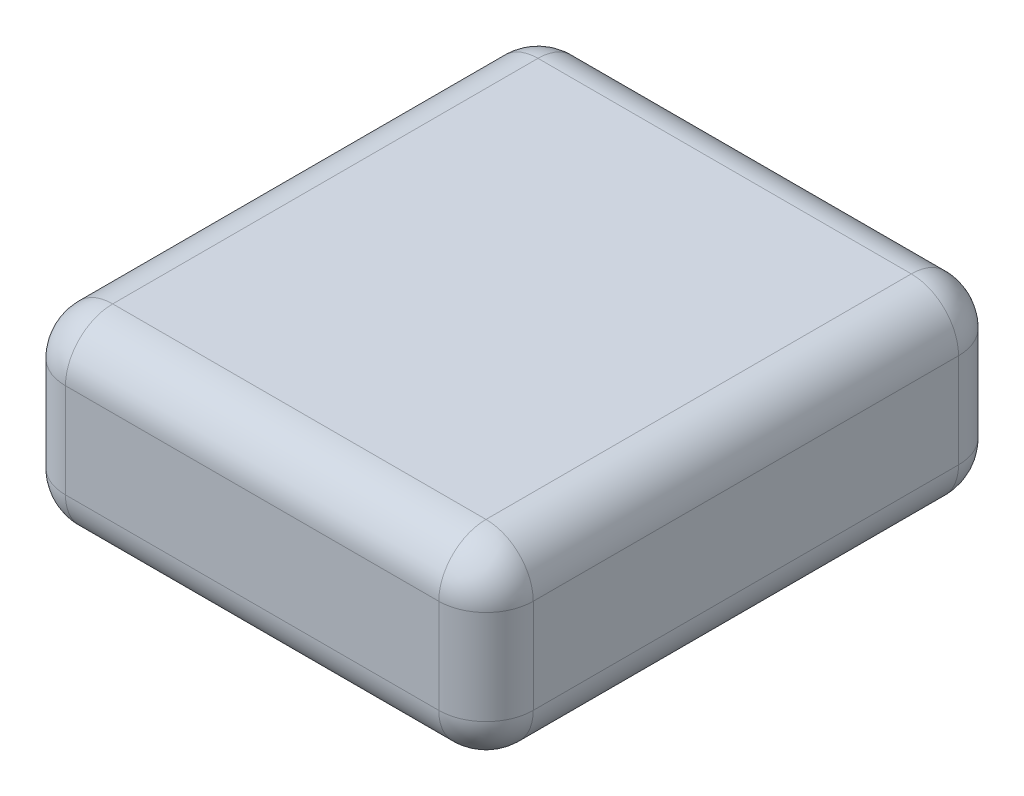
ISO-10303-21;
HEADER;
FILE_DESCRIPTION(('STEP AP214'),'2;1');
FILE_NAME('part.step','',(''),(''),'','','');
FILE_SCHEMA(('AUTOMOTIVE_DESIGN { 1 0 10303 214 1 1 1 1 }'));
ENDSEC;
DATA;
#1=APPLICATION_CONTEXT('core data for automotive mechanical design processes');
#2=APPLICATION_PROTOCOL_DEFINITION('international standard','automotive_design',2000,#1);
#3=PRODUCT_CONTEXT('',#1,'mechanical');
#4=PRODUCT('Part','Part','',(#3));
#5=PRODUCT_RELATED_PRODUCT_CATEGORY('part','',(#4));
#6=PRODUCT_DEFINITION_FORMATION('','',#4);
#7=PRODUCT_DEFINITION_CONTEXT('part definition',#1,'design');
#8=PRODUCT_DEFINITION('design','',#6,#7);
#9=PRODUCT_DEFINITION_SHAPE('','',#8);
#10=(LENGTH_UNIT() NAMED_UNIT(*) SI_UNIT(.MILLI.,.METRE.));
#11=(NAMED_UNIT(*) PLANE_ANGLE_UNIT() SI_UNIT($,.RADIAN.));
#12=(NAMED_UNIT(*) SI_UNIT($,.STERADIAN.) SOLID_ANGLE_UNIT());
#13=UNCERTAINTY_MEASURE_WITH_UNIT(LENGTH_MEASURE(1.E-05),#10,'distance_accuracy_value','');
#14=(GEOMETRIC_REPRESENTATION_CONTEXT(3) GLOBAL_UNCERTAINTY_ASSIGNED_CONTEXT((#13)) GLOBAL_UNIT_ASSIGNED_CONTEXT((#10,
#11,#12)) REPRESENTATION_CONTEXT('',''));
#15=CARTESIAN_POINT('',(0.,0.,0.));
#16=DIRECTION('',(0.,0.,1.));
#17=DIRECTION('',(1.,0.,0.));
#18=AXIS2_PLACEMENT_3D('',#15,#16,#17);
#19=CARTESIAN_POINT('',(-25.1009174311927,8.,22.));
#20=DIRECTION('',(1.,0.,0.));
#21=DIRECTION('',(0.,0.,-1.));
#22=AXIS2_PLACEMENT_3D('',#19,#20,#21);
#23=PLANE('',#22);
#24=DIRECTION('',(0.,-1.,0.));
#25=VECTOR('',#24,1.);
#26=CARTESIAN_POINT('',(-25.1009174311927,8.,2.));
#27=LINE('',#26,#25);
#28=CARTESIAN_POINT('',(-25.1009174311927,6.,2.));
#29=VERTEX_POINT('',#28);
#30=CARTESIAN_POINT('',(-25.1009174311927,2.,2.));
#31=VERTEX_POINT('',#30);
#32=EDGE_CURVE('E218',#29,#31,#27,.T.);
#33=ORIENTED_EDGE('',*,*,#32,.T.);
#34=DIRECTION('',(0.,0.,-1.));
#35=VECTOR('',#34,1.);
#36=CARTESIAN_POINT('',(-25.1009174311927,2.,22.));
#37=LINE('',#36,#35);
#38=CARTESIAN_POINT('',(-25.1009174311927,2.,20.));
#39=VERTEX_POINT('',#38);
#40=EDGE_CURVE('E226',#31,#39,#37,.F.);
#41=ORIENTED_EDGE('',*,*,#40,.T.);
#42=DIRECTION('',(0.,-1.,0.));
#43=VECTOR('',#42,1.);
#44=CARTESIAN_POINT('',(-25.1009174311927,8.,20.));
#45=LINE('',#44,#43);
#46=CARTESIAN_POINT('',(-25.1009174311927,6.,20.));
#47=VERTEX_POINT('',#46);
#48=EDGE_CURVE('E215',#39,#47,#45,.F.);
#49=ORIENTED_EDGE('',*,*,#48,.T.);
#50=DIRECTION('',(0.,0.,-1.));
#51=VECTOR('',#50,1.);
#52=CARTESIAN_POINT('',(-25.1009174311927,6.,22.));
#53=LINE('',#52,#51);
#54=EDGE_CURVE('E212',#47,#29,#53,.T.);
#55=ORIENTED_EDGE('',*,*,#54,.T.);
#56=EDGE_LOOP('',(#33,#41,#49,#55));
#57=FACE_BOUND('',#56,.T.);
#58=ADVANCED_FACE('F33',(#57),#23,.F.);
#59=CARTESIAN_POINT('',(-25.1009174311927,0.,22.));
#60=DIRECTION('',(0.,1.,0.));
#61=DIRECTION('',(0.,0.,1.));
#62=AXIS2_PLACEMENT_3D('',#59,#60,#61);
#63=PLANE('',#62);
#64=DIRECTION('',(0.,0.,-1.));
#65=VECTOR('',#64,1.);
#66=CARTESIAN_POINT('',(-23.1009174311927,0.,22.));
#67=LINE('',#66,#65);
#68=CARTESIAN_POINT('',(-23.1009174311927,0.,20.));
#69=VERTEX_POINT('',#68);
#70=CARTESIAN_POINT('',(-23.1009174311927,0.,2.));
#71=VERTEX_POINT('',#70);
#72=EDGE_CURVE('E131',#69,#71,#67,.T.);
#73=ORIENTED_EDGE('',*,*,#72,.T.);
#74=DIRECTION('',(1.,0.,0.));
#75=VECTOR('',#74,1.);
#76=CARTESIAN_POINT('',(-25.1009174311927,0.,2.));
#77=LINE('',#76,#75);
#78=CARTESIAN_POINT('',(-7.30091743119267,0.,2.));
#79=VERTEX_POINT('',#78);
#80=EDGE_CURVE('E127',#71,#79,#77,.T.);
#81=ORIENTED_EDGE('',*,*,#80,.T.);
#82=DIRECTION('',(0.,0.,-1.));
#83=VECTOR('',#82,1.);
#84=CARTESIAN_POINT('',(-7.30091743119267,0.,22.));
#85=LINE('',#84,#83);
#86=CARTESIAN_POINT('',(-7.30091743119267,0.,20.));
#87=VERTEX_POINT('',#86);
#88=EDGE_CURVE('E121',#79,#87,#85,.F.);
#89=ORIENTED_EDGE('',*,*,#88,.T.);
#90=DIRECTION('',(1.,0.,0.));
#91=VECTOR('',#90,1.);
#92=CARTESIAN_POINT('',(-25.1009174311927,0.,20.));
#93=LINE('',#92,#91);
#94=EDGE_CURVE('E124',#87,#69,#93,.F.);
#95=ORIENTED_EDGE('',*,*,#94,.T.);
#96=EDGE_LOOP('',(#73,#81,#89,#95));
#97=FACE_BOUND('',#96,.T.);
#98=ADVANCED_FACE('F123',(#97),#63,.F.);
#99=CARTESIAN_POINT('',(-5.30091743119267,8.,22.));
#100=DIRECTION('',(-1.,0.,0.));
#101=DIRECTION('',(0.,0.,1.));
#102=AXIS2_PLACEMENT_3D('',#99,#100,#101);
#103=PLANE('',#102);
#104=DIRECTION('',(0.,1.,0.));
#105=VECTOR('',#104,1.);
#106=CARTESIAN_POINT('',(-5.30091743119267,0.,20.));
#107=LINE('',#106,#105);
#108=CARTESIAN_POINT('',(-5.30091743119267,6.,20.));
#109=VERTEX_POINT('',#108);
#110=CARTESIAN_POINT('',(-5.30091743119267,2.,20.));
#111=VERTEX_POINT('',#110);
#112=EDGE_CURVE('E231',#109,#111,#107,.F.);
#113=ORIENTED_EDGE('',*,*,#112,.T.);
#114=DIRECTION('',(0.,0.,-1.));
#115=VECTOR('',#114,1.);
#116=CARTESIAN_POINT('',(-5.30091743119267,2.,22.));
#117=LINE('',#116,#115);
#118=CARTESIAN_POINT('',(-5.30091743119267,2.,2.));
#119=VERTEX_POINT('',#118);
#120=EDGE_CURVE('E154',#111,#119,#117,.T.);
#121=ORIENTED_EDGE('',*,*,#120,.T.);
#122=DIRECTION('',(0.,1.,0.));
#123=VECTOR('',#122,1.);
#124=CARTESIAN_POINT('',(-5.30091743119267,8.,2.));
#125=LINE('',#124,#123);
#126=CARTESIAN_POINT('',(-5.30091743119267,6.,2.));
#127=VERTEX_POINT('',#126);
#128=EDGE_CURVE('E233',#119,#127,#125,.T.);
#129=ORIENTED_EDGE('',*,*,#128,.T.);
#130=DIRECTION('',(0.,0.,-1.));
#131=VECTOR('',#130,1.);
#132=CARTESIAN_POINT('',(-5.30091743119267,6.,22.));
#133=LINE('',#132,#131);
#134=EDGE_CURVE('E229',#127,#109,#133,.F.);
#135=ORIENTED_EDGE('',*,*,#134,.T.);
#136=EDGE_LOOP('',(#113,#121,#129,#135));
#137=FACE_BOUND('',#136,.T.);
#138=ADVANCED_FACE('F288',(#137),#103,.F.);
#139=CARTESIAN_POINT('',(-25.1009174311927,8.,22.));
#140=DIRECTION('',(0.,-1.,0.));
#141=DIRECTION('',(0.,0.,-1.));
#142=AXIS2_PLACEMENT_3D('',#139,#140,#141);
#143=PLANE('',#142);
#144=DIRECTION('',(-1.,0.,0.));
#145=VECTOR('',#144,1.);
#146=CARTESIAN_POINT('',(-5.30091743119267,8.,20.));
#147=LINE('',#146,#145);
#148=CARTESIAN_POINT('',(-23.1009174311927,8.,20.));
#149=VERTEX_POINT('',#148);
#150=CARTESIAN_POINT('',(-7.30091743119267,8.,20.));
#151=VERTEX_POINT('',#150);
#152=EDGE_CURVE('E42',#149,#151,#147,.F.);
#153=ORIENTED_EDGE('',*,*,#152,.T.);
#154=DIRECTION('',(0.,0.,-1.));
#155=VECTOR('',#154,1.);
#156=CARTESIAN_POINT('',(-7.30091743119267,8.,22.));
#157=LINE('',#156,#155);
#158=CARTESIAN_POINT('',(-7.30091743119267,8.,2.));
#159=VERTEX_POINT('',#158);
#160=EDGE_CURVE('E11',#151,#159,#157,.T.);
#161=ORIENTED_EDGE('',*,*,#160,.T.);
#162=DIRECTION('',(-1.,0.,0.));
#163=VECTOR('',#162,1.);
#164=CARTESIAN_POINT('',(-25.1009174311927,8.,2.));
#165=LINE('',#164,#163);
#166=CARTESIAN_POINT('',(-23.1009174311927,8.,2.));
#167=VERTEX_POINT('',#166);
#168=EDGE_CURVE('E245',#159,#167,#165,.T.);
#169=ORIENTED_EDGE('',*,*,#168,.T.);
#170=DIRECTION('',(0.,0.,-1.));
#171=VECTOR('',#170,1.);
#172=CARTESIAN_POINT('',(-23.1009174311927,8.,22.));
#173=LINE('',#172,#171);
#174=EDGE_CURVE('E53',#167,#149,#173,.F.);
#175=ORIENTED_EDGE('',*,*,#174,.T.);
#176=EDGE_LOOP('',(#153,#161,#169,#175));
#177=FACE_BOUND('',#176,.T.);
#178=ADVANCED_FACE('F499',(#177),#143,.F.);
#179=CARTESIAN_POINT('',(0.,0.,22.));
#180=DIRECTION('',(0.,0.,1.));
#181=DIRECTION('',(1.,0.,0.));
#182=AXIS2_PLACEMENT_3D('',#179,#180,#181);
#183=PLANE('',#182);
#184=DIRECTION('',(1.,0.,0.));
#185=VECTOR('',#184,1.);
#186=CARTESIAN_POINT('',(-5.30091743119267,2.,22.));
#187=LINE('',#186,#185);
#188=CARTESIAN_POINT('',(-23.1009174311927,2.,22.));
#189=VERTEX_POINT('',#188);
#190=CARTESIAN_POINT('',(-7.30091743119267,2.,22.));
#191=VERTEX_POINT('',#190);
#192=EDGE_CURVE('E240',#189,#191,#187,.T.);
#193=ORIENTED_EDGE('',*,*,#192,.T.);
#194=DIRECTION('',(0.,1.,0.));
#195=VECTOR('',#194,1.);
#196=CARTESIAN_POINT('',(-7.30091743119267,8.,22.));
#197=LINE('',#196,#195);
#198=CARTESIAN_POINT('',(-7.30091743119267,6.,22.));
#199=VERTEX_POINT('',#198);
#200=EDGE_CURVE('E242',#191,#199,#197,.T.);
#201=ORIENTED_EDGE('',*,*,#200,.T.);
#202=DIRECTION('',(-1.,0.,0.));
#203=VECTOR('',#202,1.);
#204=CARTESIAN_POINT('',(-25.1009174311927,6.,22.));
#205=LINE('',#204,#203);
#206=CARTESIAN_POINT('',(-23.1009174311927,6.,22.));
#207=VERTEX_POINT('',#206);
#208=EDGE_CURVE('E236',#199,#207,#205,.T.);
#209=ORIENTED_EDGE('',*,*,#208,.T.);
#210=DIRECTION('',(0.,-1.,0.));
#211=VECTOR('',#210,1.);
#212=CARTESIAN_POINT('',(-23.1009174311927,0.,22.));
#213=LINE('',#212,#211);
#214=EDGE_CURVE('E238',#207,#189,#213,.T.);
#215=ORIENTED_EDGE('',*,*,#214,.T.);
#216=EDGE_LOOP('',(#193,#201,#209,#215));
#217=FACE_BOUND('',#216,.T.);
#218=ADVANCED_FACE('F294',(#217),#183,.T.);
#219=CARTESIAN_POINT('',(0.,0.,0.));
#220=DIRECTION('',(0.,0.,1.));
#221=DIRECTION('',(1.,0.,0.));
#222=AXIS2_PLACEMENT_3D('',#219,#220,#221);
#223=PLANE('',#222);
#224=DIRECTION('',(0.,1.,0.));
#225=VECTOR('',#224,1.);
#226=CARTESIAN_POINT('',(-7.30091743119267,0.,0.));
#227=LINE('',#226,#225);
#228=CARTESIAN_POINT('',(-7.30091743119267,6.,0.));
#229=VERTEX_POINT('',#228);
#230=CARTESIAN_POINT('',(-7.30091743119267,2.,0.));
#231=VERTEX_POINT('',#230);
#232=EDGE_CURVE('E272',#229,#231,#227,.F.);
#233=ORIENTED_EDGE('',*,*,#232,.T.);
#234=DIRECTION('',(1.,0.,0.));
#235=VECTOR('',#234,1.);
#236=CARTESIAN_POINT('',(0.,2.,0.));
#237=LINE('',#236,#235);
#238=CARTESIAN_POINT('',(-23.1009174311927,2.,0.));
#239=VERTEX_POINT('',#238);
#240=EDGE_CURVE('E216',#231,#239,#237,.F.);
#241=ORIENTED_EDGE('',*,*,#240,.T.);
#242=DIRECTION('',(0.,-1.,0.));
#243=VECTOR('',#242,1.);
#244=CARTESIAN_POINT('',(-23.1009174311927,0.,0.));
#245=LINE('',#244,#243);
#246=CARTESIAN_POINT('',(-23.1009174311927,6.,0.));
#247=VERTEX_POINT('',#246);
#248=EDGE_CURVE('E221',#239,#247,#245,.F.);
#249=ORIENTED_EDGE('',*,*,#248,.T.);
#250=DIRECTION('',(-1.,0.,0.));
#251=VECTOR('',#250,1.);
#252=CARTESIAN_POINT('',(0.,6.,0.));
#253=LINE('',#252,#251);
#254=EDGE_CURVE('E306',#247,#229,#253,.F.);
#255=ORIENTED_EDGE('',*,*,#254,.T.);
#256=EDGE_LOOP('',(#233,#241,#249,#255));
#257=FACE_BOUND('',#256,.T.);
#258=ADVANCED_FACE('F274',(#257),#223,.F.);
#259=CARTESIAN_POINT('',(0.,6.,20.));
#260=DIRECTION('',(1.,0.,0.));
#261=DIRECTION('',(0.,0.,-1.));
#262=AXIS2_PLACEMENT_3D('',#259,#260,#261);
#263=CYLINDRICAL_SURFACE('',#262,2.);
#264=CARTESIAN_POINT('',(-23.1009174311927,6.,20.));
#265=DIRECTION('',(-1.,0.,0.));
#266=DIRECTION('',(0.,0.,1.));
#267=AXIS2_PLACEMENT_3D('',#264,#265,#266);
#268=CIRCLE('',#267,2.);
#269=EDGE_CURVE('E37',#207,#149,#268,.T.);
#270=ORIENTED_EDGE('',*,*,#269,.F.);
#271=ORIENTED_EDGE('',*,*,#208,.F.);
#272=CARTESIAN_POINT('',(-7.30091743119267,6.,20.));
#273=DIRECTION('',(1.,0.,0.));
#274=DIRECTION('',(0.,0.,-1.));
#275=AXIS2_PLACEMENT_3D('',#272,#273,#274);
#276=CIRCLE('',#275,2.);
#277=EDGE_CURVE('E193',#151,#199,#276,.T.);
#278=ORIENTED_EDGE('',*,*,#277,.F.);
#279=ORIENTED_EDGE('',*,*,#152,.F.);
#280=EDGE_LOOP('',(#270,#271,#278,#279));
#281=FACE_BOUND('',#280,.T.);
#282=ADVANCED_FACE('F35',(#281),#263,.T.);
#283=CARTESIAN_POINT('',(-23.1009174311927,6.,20.));
#284=DIRECTION('',(0.,0.,1.));
#285=DIRECTION('',(1.,0.,0.));
#286=AXIS2_PLACEMENT_3D('',#283,#284,#285);
#287=SPHERICAL_SURFACE('',#286,2.);
#288=CARTESIAN_POINT('',(-23.1009174311927,6.,20.));
#289=DIRECTION('',(0.,1.,0.));
#290=DIRECTION('',(0.,0.,1.));
#291=AXIS2_PLACEMENT_3D('',#288,#289,#290);
#292=CIRCLE('',#291,2.);
#293=EDGE_CURVE('E188',#207,#47,#292,.F.);
#294=ORIENTED_EDGE('',*,*,#293,.F.);
#295=ORIENTED_EDGE('',*,*,#269,.T.);
#296=CARTESIAN_POINT('',(-23.1009174311927,6.,20.));
#297=DIRECTION('',(0.,0.,1.));
#298=DIRECTION('',(1.,0.,0.));
#299=AXIS2_PLACEMENT_3D('',#296,#297,#298);
#300=CIRCLE('',#299,2.);
#301=EDGE_CURVE('E191',#47,#149,#300,.F.);
#302=ORIENTED_EDGE('',*,*,#301,.F.);
#303=EDGE_LOOP('',(#294,#295,#302));
#304=FACE_BOUND('',#303,.T.);
#305=ADVANCED_FACE('F204',(#304),#287,.T.);
#306=CARTESIAN_POINT('',(-7.30091743119267,6.,20.));
#307=DIRECTION('',(0.,0.,1.));
#308=DIRECTION('',(1.,0.,0.));
#309=AXIS2_PLACEMENT_3D('',#306,#307,#308);
#310=SPHERICAL_SURFACE('',#309,2.);
#311=CARTESIAN_POINT('',(-7.30091743119267,6.,20.));
#312=DIRECTION('',(0.,0.,1.));
#313=DIRECTION('',(1.,0.,0.));
#314=AXIS2_PLACEMENT_3D('',#311,#312,#313);
#315=CIRCLE('',#314,2.);
#316=EDGE_CURVE('E183',#151,#109,#315,.F.);
#317=ORIENTED_EDGE('',*,*,#316,.F.);
#318=ORIENTED_EDGE('',*,*,#277,.T.);
#319=CARTESIAN_POINT('',(-7.30091743119267,6.,20.));
#320=DIRECTION('',(0.,1.,0.));
#321=DIRECTION('',(0.,0.,1.));
#322=AXIS2_PLACEMENT_3D('',#319,#320,#321);
#323=CIRCLE('',#322,2.);
#324=EDGE_CURVE('E186',#109,#199,#323,.F.);
#325=ORIENTED_EDGE('',*,*,#324,.F.);
#326=EDGE_LOOP('',(#317,#318,#325));
#327=FACE_BOUND('',#326,.T.);
#328=ADVANCED_FACE('F320',(#327),#310,.T.);
#329=CARTESIAN_POINT('',(-23.1009174311927,6.,22.));
#330=DIRECTION('',(0.,0.,-1.));
#331=DIRECTION('',(-1.,0.,0.));
#332=AXIS2_PLACEMENT_3D('',#329,#330,#331);
#333=CYLINDRICAL_SURFACE('',#332,2.);
#334=ORIENTED_EDGE('',*,*,#301,.T.);
#335=ORIENTED_EDGE('',*,*,#174,.F.);
#336=CARTESIAN_POINT('',(-23.1009174311927,6.,2.));
#337=DIRECTION('',(0.,0.,-1.));
#338=DIRECTION('',(-1.,0.,0.));
#339=AXIS2_PLACEMENT_3D('',#336,#337,#338);
#340=CIRCLE('',#339,2.);
#341=EDGE_CURVE('E177',#29,#167,#340,.T.);
#342=ORIENTED_EDGE('',*,*,#341,.F.);
#343=ORIENTED_EDGE('',*,*,#54,.F.);
#344=EDGE_LOOP('',(#334,#335,#342,#343));
#345=FACE_BOUND('',#344,.T.);
#346=ADVANCED_FACE('F209',(#345),#333,.T.);
#347=CARTESIAN_POINT('',(-23.1009174311927,0.,20.));
#348=DIRECTION('',(0.,1.,0.));
#349=DIRECTION('',(0.,0.,1.));
#350=AXIS2_PLACEMENT_3D('',#347,#348,#349);
#351=CYLINDRICAL_SURFACE('',#350,2.);
#352=ORIENTED_EDGE('',*,*,#293,.T.);
#353=ORIENTED_EDGE('',*,*,#48,.F.);
#354=CARTESIAN_POINT('',(-23.1009174311927,2.,20.));
#355=DIRECTION('',(0.,-1.,0.));
#356=DIRECTION('',(0.,0.,-1.));
#357=AXIS2_PLACEMENT_3D('',#354,#355,#356);
#358=CIRCLE('',#357,2.);
#359=EDGE_CURVE('E174',#189,#39,#358,.T.);
#360=ORIENTED_EDGE('',*,*,#359,.F.);
#361=ORIENTED_EDGE('',*,*,#214,.F.);
#362=EDGE_LOOP('',(#352,#353,#360,#361));
#363=FACE_BOUND('',#362,.T.);
#364=ADVANCED_FACE('F298',(#363),#351,.T.);
#365=CARTESIAN_POINT('',(0.,2.,20.));
#366=DIRECTION('',(-1.,0.,0.));
#367=DIRECTION('',(0.,0.,1.));
#368=AXIS2_PLACEMENT_3D('',#365,#366,#367);
#369=CYLINDRICAL_SURFACE('',#368,2.);
#370=CARTESIAN_POINT('',(-7.30091743119267,2.,20.));
#371=DIRECTION('',(1.,0.,0.));
#372=DIRECTION('',(0.,0.,-1.));
#373=AXIS2_PLACEMENT_3D('',#370,#371,#372);
#374=CIRCLE('',#373,2.);
#375=EDGE_CURVE('E138',#191,#87,#374,.T.);
#376=ORIENTED_EDGE('',*,*,#375,.F.);
#377=ORIENTED_EDGE('',*,*,#192,.F.);
#378=CARTESIAN_POINT('',(-23.1009174311927,2.,20.));
#379=DIRECTION('',(-1.,0.,0.));
#380=DIRECTION('',(0.,0.,1.));
#381=AXIS2_PLACEMENT_3D('',#378,#379,#380);
#382=CIRCLE('',#381,2.);
#383=EDGE_CURVE('E141',#69,#189,#382,.T.);
#384=ORIENTED_EDGE('',*,*,#383,.F.);
#385=ORIENTED_EDGE('',*,*,#94,.F.);
#386=EDGE_LOOP('',(#376,#377,#384,#385));
#387=FACE_BOUND('',#386,.T.);
#388=ADVANCED_FACE('F136',(#387),#369,.T.);
#389=CARTESIAN_POINT('',(-7.30091743119267,0.,20.));
#390=DIRECTION('',(0.,-1.,0.));
#391=DIRECTION('',(0.,0.,-1.));
#392=AXIS2_PLACEMENT_3D('',#389,#390,#391);
#393=CYLINDRICAL_SURFACE('',#392,2.);
#394=ORIENTED_EDGE('',*,*,#324,.T.);
#395=ORIENTED_EDGE('',*,*,#200,.F.);
#396=CARTESIAN_POINT('',(-7.30091743119267,2.,20.));
#397=DIRECTION('',(0.,-1.,0.));
#398=DIRECTION('',(0.,0.,-1.));
#399=AXIS2_PLACEMENT_3D('',#396,#397,#398);
#400=CIRCLE('',#399,2.);
#401=EDGE_CURVE('E150',#111,#191,#400,.T.);
#402=ORIENTED_EDGE('',*,*,#401,.F.);
#403=ORIENTED_EDGE('',*,*,#112,.F.);
#404=EDGE_LOOP('',(#394,#395,#402,#403));
#405=FACE_BOUND('',#404,.T.);
#406=ADVANCED_FACE('F292',(#405),#393,.T.);
#407=CARTESIAN_POINT('',(-7.30091743119267,6.,22.));
#408=DIRECTION('',(0.,0.,-1.));
#409=DIRECTION('',(-1.,0.,0.));
#410=AXIS2_PLACEMENT_3D('',#407,#408,#409);
#411=CYLINDRICAL_SURFACE('',#410,2.);
#412=ORIENTED_EDGE('',*,*,#316,.T.);
#413=ORIENTED_EDGE('',*,*,#134,.F.);
#414=CARTESIAN_POINT('',(-7.30091743119267,6.,2.));
#415=DIRECTION('',(0.,0.,-1.));
#416=DIRECTION('',(-1.,0.,0.));
#417=AXIS2_PLACEMENT_3D('',#414,#415,#416);
#418=CIRCLE('',#417,2.);
#419=EDGE_CURVE('E169',#159,#127,#418,.T.);
#420=ORIENTED_EDGE('',*,*,#419,.F.);
#421=ORIENTED_EDGE('',*,*,#160,.F.);
#422=EDGE_LOOP('',(#412,#413,#420,#421));
#423=FACE_BOUND('',#422,.T.);
#424=ADVANCED_FACE('F319',(#423),#411,.T.);
#425=CARTESIAN_POINT('',(-25.1009174311927,6.,2.));
#426=DIRECTION('',(-1.,0.,0.));
#427=DIRECTION('',(0.,0.,1.));
#428=AXIS2_PLACEMENT_3D('',#425,#426,#427);
#429=CYLINDRICAL_SURFACE('',#428,2.);
#430=CARTESIAN_POINT('',(-23.1009174311927,6.,2.));
#431=DIRECTION('',(-1.,0.,0.));
#432=DIRECTION('',(0.,0.,1.));
#433=AXIS2_PLACEMENT_3D('',#430,#431,#432);
#434=CIRCLE('',#433,2.);
#435=EDGE_CURVE('E180',#167,#247,#434,.T.);
#436=ORIENTED_EDGE('',*,*,#435,.F.);
#437=ORIENTED_EDGE('',*,*,#168,.F.);
#438=CARTESIAN_POINT('',(-7.30091743119267,6.,2.));
#439=DIRECTION('',(1.,0.,0.));
#440=DIRECTION('',(0.,1.,0.));
#441=AXIS2_PLACEMENT_3D('',#438,#439,#440);
#442=CIRCLE('',#441,2.);
#443=EDGE_CURVE('E167',#229,#159,#442,.T.);
#444=ORIENTED_EDGE('',*,*,#443,.F.);
#445=ORIENTED_EDGE('',*,*,#254,.F.);
#446=EDGE_LOOP('',(#436,#437,#444,#445));
#447=FACE_BOUND('',#446,.T.);
#448=ADVANCED_FACE('F313',(#447),#429,.T.);
#449=CARTESIAN_POINT('',(-23.1009174311927,6.,2.));
#450=DIRECTION('',(0.,0.,1.));
#451=DIRECTION('',(1.,0.,0.));
#452=AXIS2_PLACEMENT_3D('',#449,#450,#451);
#453=SPHERICAL_SURFACE('',#452,2.);
#454=ORIENTED_EDGE('',*,*,#341,.T.);
#455=ORIENTED_EDGE('',*,*,#435,.T.);
#456=CARTESIAN_POINT('',(-23.1009174311927,6.,2.));
#457=DIRECTION('',(0.,1.,0.));
#458=DIRECTION('',(0.,0.,1.));
#459=AXIS2_PLACEMENT_3D('',#456,#457,#458);
#460=CIRCLE('',#459,2.);
#461=EDGE_CURVE('E158',#29,#247,#460,.F.);
#462=ORIENTED_EDGE('',*,*,#461,.F.);
#463=EDGE_LOOP('',(#454,#455,#462));
#464=FACE_BOUND('',#463,.T.);
#465=ADVANCED_FACE('F356',(#464),#453,.T.);
#466=CARTESIAN_POINT('',(-23.1009174311927,2.,20.));
#467=DIRECTION('',(0.,0.,1.));
#468=DIRECTION('',(1.,0.,0.));
#469=AXIS2_PLACEMENT_3D('',#466,#467,#468);
#470=SPHERICAL_SURFACE('',#469,2.);
#471=ORIENTED_EDGE('',*,*,#383,.T.);
#472=ORIENTED_EDGE('',*,*,#359,.T.);
#473=CARTESIAN_POINT('',(-23.1009174311927,2.,20.));
#474=DIRECTION('',(0.,0.,1.));
#475=DIRECTION('',(1.,0.,0.));
#476=AXIS2_PLACEMENT_3D('',#473,#474,#475);
#477=CIRCLE('',#476,2.);
#478=EDGE_CURVE('E155',#69,#39,#477,.F.);
#479=ORIENTED_EDGE('',*,*,#478,.F.);
#480=EDGE_LOOP('',(#471,#472,#479));
#481=FACE_BOUND('',#480,.T.);
#482=ADVANCED_FACE('F300',(#481),#470,.T.);
#483=CARTESIAN_POINT('',(-7.30091743119267,2.,20.));
#484=DIRECTION('',(0.,0.,1.));
#485=DIRECTION('',(1.,0.,0.));
#486=AXIS2_PLACEMENT_3D('',#483,#484,#485);
#487=SPHERICAL_SURFACE('',#486,2.);
#488=ORIENTED_EDGE('',*,*,#401,.T.);
#489=ORIENTED_EDGE('',*,*,#375,.T.);
#490=CARTESIAN_POINT('',(-7.30091743119267,2.,20.));
#491=DIRECTION('',(0.,0.,1.));
#492=DIRECTION('',(1.,0.,0.));
#493=AXIS2_PLACEMENT_3D('',#490,#491,#492);
#494=CIRCLE('',#493,2.);
#495=EDGE_CURVE('E147',#111,#87,#494,.F.);
#496=ORIENTED_EDGE('',*,*,#495,.F.);
#497=EDGE_LOOP('',(#488,#489,#496));
#498=FACE_BOUND('',#497,.T.);
#499=ADVANCED_FACE('F146',(#498),#487,.T.);
#500=CARTESIAN_POINT('',(-7.30091743119267,6.,2.));
#501=DIRECTION('',(0.,0.,1.));
#502=DIRECTION('',(1.,0.,0.));
#503=AXIS2_PLACEMENT_3D('',#500,#501,#502);
#504=SPHERICAL_SURFACE('',#503,2.);
#505=ORIENTED_EDGE('',*,*,#443,.T.);
#506=ORIENTED_EDGE('',*,*,#419,.T.);
#507=CARTESIAN_POINT('',(-7.30091743119267,6.,2.));
#508=DIRECTION('',(0.,1.,0.));
#509=DIRECTION('',(0.,0.,1.));
#510=AXIS2_PLACEMENT_3D('',#507,#508,#509);
#511=CIRCLE('',#510,2.);
#512=EDGE_CURVE('E156',#229,#127,#511,.F.);
#513=ORIENTED_EDGE('',*,*,#512,.F.);
#514=EDGE_LOOP('',(#505,#506,#513));
#515=FACE_BOUND('',#514,.T.);
#516=ADVANCED_FACE('F316',(#515),#504,.T.);
#517=CARTESIAN_POINT('',(-23.1009174311927,8.,2.));
#518=DIRECTION('',(0.,-1.,0.));
#519=DIRECTION('',(0.,0.,-1.));
#520=AXIS2_PLACEMENT_3D('',#517,#518,#519);
#521=CYLINDRICAL_SURFACE('',#520,2.);
#522=ORIENTED_EDGE('',*,*,#461,.T.);
#523=ORIENTED_EDGE('',*,*,#248,.F.);
#524=CARTESIAN_POINT('',(-23.1009174311927,2.,2.));
#525=DIRECTION('',(0.,-1.,0.));
#526=DIRECTION('',(0.,0.,-1.));
#527=AXIS2_PLACEMENT_3D('',#524,#525,#526);
#528=CIRCLE('',#527,2.);
#529=EDGE_CURVE('E161',#31,#239,#528,.T.);
#530=ORIENTED_EDGE('',*,*,#529,.F.);
#531=ORIENTED_EDGE('',*,*,#32,.F.);
#532=EDGE_LOOP('',(#522,#523,#530,#531));
#533=FACE_BOUND('',#532,.T.);
#534=ADVANCED_FACE('F269',(#533),#521,.T.);
#535=CARTESIAN_POINT('',(-23.1009174311927,2.,22.));
#536=DIRECTION('',(0.,0.,-1.));
#537=DIRECTION('',(-1.,0.,0.));
#538=AXIS2_PLACEMENT_3D('',#535,#536,#537);
#539=CYLINDRICAL_SURFACE('',#538,2.);
#540=ORIENTED_EDGE('',*,*,#478,.T.);
#541=ORIENTED_EDGE('',*,*,#40,.F.);
#542=CARTESIAN_POINT('',(-23.1009174311927,2.,2.));
#543=DIRECTION('',(0.,0.,-1.));
#544=DIRECTION('',(-1.,0.,0.));
#545=AXIS2_PLACEMENT_3D('',#542,#543,#544);
#546=CIRCLE('',#545,2.);
#547=EDGE_CURVE('E258',#71,#31,#546,.T.);
#548=ORIENTED_EDGE('',*,*,#547,.F.);
#549=ORIENTED_EDGE('',*,*,#72,.F.);
#550=EDGE_LOOP('',(#540,#541,#548,#549));
#551=FACE_BOUND('',#550,.T.);
#552=ADVANCED_FACE('F304',(#551),#539,.T.);
#553=CARTESIAN_POINT('',(-7.30091743119267,2.,22.));
#554=DIRECTION('',(0.,0.,-1.));
#555=DIRECTION('',(-1.,0.,0.));
#556=AXIS2_PLACEMENT_3D('',#553,#554,#555);
#557=CYLINDRICAL_SURFACE('',#556,2.);
#558=ORIENTED_EDGE('',*,*,#495,.T.);
#559=ORIENTED_EDGE('',*,*,#88,.F.);
#560=CARTESIAN_POINT('',(-7.30091743119267,2.,2.));
#561=DIRECTION('',(0.,0.,-1.));
#562=DIRECTION('',(-1.,0.,0.));
#563=AXIS2_PLACEMENT_3D('',#560,#561,#562);
#564=CIRCLE('',#563,2.);
#565=EDGE_CURVE('E255',#119,#79,#564,.T.);
#566=ORIENTED_EDGE('',*,*,#565,.F.);
#567=ORIENTED_EDGE('',*,*,#120,.F.);
#568=EDGE_LOOP('',(#558,#559,#566,#567));
#569=FACE_BOUND('',#568,.T.);
#570=ADVANCED_FACE('F152',(#569),#557,.T.);
#571=CARTESIAN_POINT('',(-7.30091743119267,8.,2.));
#572=DIRECTION('',(0.,1.,0.));
#573=DIRECTION('',(0.,0.,1.));
#574=AXIS2_PLACEMENT_3D('',#571,#572,#573);
#575=CYLINDRICAL_SURFACE('',#574,2.);
#576=ORIENTED_EDGE('',*,*,#512,.T.);
#577=ORIENTED_EDGE('',*,*,#128,.F.);
#578=CARTESIAN_POINT('',(-7.30091743119267,2.,2.));
#579=DIRECTION('',(0.,-1.,0.));
#580=DIRECTION('',(0.,0.,-1.));
#581=AXIS2_PLACEMENT_3D('',#578,#579,#580);
#582=CIRCLE('',#581,2.);
#583=EDGE_CURVE('E253',#231,#119,#582,.T.);
#584=ORIENTED_EDGE('',*,*,#583,.F.);
#585=ORIENTED_EDGE('',*,*,#232,.F.);
#586=EDGE_LOOP('',(#576,#577,#584,#585));
#587=FACE_BOUND('',#586,.T.);
#588=ADVANCED_FACE('F284',(#587),#575,.T.);
#589=CARTESIAN_POINT('',(-23.1009174311927,2.,2.));
#590=DIRECTION('',(0.,0.,1.));
#591=DIRECTION('',(1.,0.,0.));
#592=AXIS2_PLACEMENT_3D('',#589,#590,#591);
#593=SPHERICAL_SURFACE('',#592,2.);
#594=ORIENTED_EDGE('',*,*,#547,.T.);
#595=ORIENTED_EDGE('',*,*,#529,.T.);
#596=CARTESIAN_POINT('',(-23.1009174311927,2.,2.));
#597=DIRECTION('',(-1.,0.,0.));
#598=DIRECTION('',(0.,0.,1.));
#599=AXIS2_PLACEMENT_3D('',#596,#597,#598);
#600=CIRCLE('',#599,2.);
#601=EDGE_CURVE('E251',#71,#239,#600,.F.);
#602=ORIENTED_EDGE('',*,*,#601,.F.);
#603=EDGE_LOOP('',(#594,#595,#602));
#604=FACE_BOUND('',#603,.T.);
#605=ADVANCED_FACE('F265',(#604),#593,.T.);
#606=CARTESIAN_POINT('',(-7.30091743119267,2.,2.));
#607=DIRECTION('',(0.,0.,1.));
#608=DIRECTION('',(1.,0.,0.));
#609=AXIS2_PLACEMENT_3D('',#606,#607,#608);
#610=SPHERICAL_SURFACE('',#609,2.);
#611=ORIENTED_EDGE('',*,*,#583,.T.);
#612=ORIENTED_EDGE('',*,*,#565,.T.);
#613=CARTESIAN_POINT('',(-7.30091743119267,2.,2.));
#614=DIRECTION('',(1.,0.,0.));
#615=DIRECTION('',(0.,0.,-1.));
#616=AXIS2_PLACEMENT_3D('',#613,#614,#615);
#617=CIRCLE('',#616,2.);
#618=EDGE_CURVE('E249',#231,#79,#617,.F.);
#619=ORIENTED_EDGE('',*,*,#618,.F.);
#620=EDGE_LOOP('',(#611,#612,#619));
#621=FACE_BOUND('',#620,.T.);
#622=ADVANCED_FACE('F281',(#621),#610,.T.);
#623=CARTESIAN_POINT('',(-25.1009174311927,2.,2.));
#624=DIRECTION('',(1.,0.,0.));
#625=DIRECTION('',(0.,0.,-1.));
#626=AXIS2_PLACEMENT_3D('',#623,#624,#625);
#627=CYLINDRICAL_SURFACE('',#626,2.);
#628=ORIENTED_EDGE('',*,*,#601,.T.);
#629=ORIENTED_EDGE('',*,*,#240,.F.);
#630=ORIENTED_EDGE('',*,*,#618,.T.);
#631=ORIENTED_EDGE('',*,*,#80,.F.);
#632=EDGE_LOOP('',(#628,#629,#630,#631));
#633=FACE_BOUND('',#632,.T.);
#634=ADVANCED_FACE('F279',(#633),#627,.T.);
#635=CLOSED_SHELL('',(#58,#98,#138,#178,#218,#258,#282,#305,#328,#346,#364,#388,#406,#424,#448,
#465,#482,#499,#516,#534,#552,#570,#588,#605,#622,#634));
#636=MANIFOLD_SOLID_BREP('B2',#635);
#637=ADVANCED_BREP_SHAPE_REPRESENTATION('',(#18,#636),#14);
#638=SHAPE_DEFINITION_REPRESENTATION(#9,#637);
ENDSEC;
END-ISO-10303-21;
